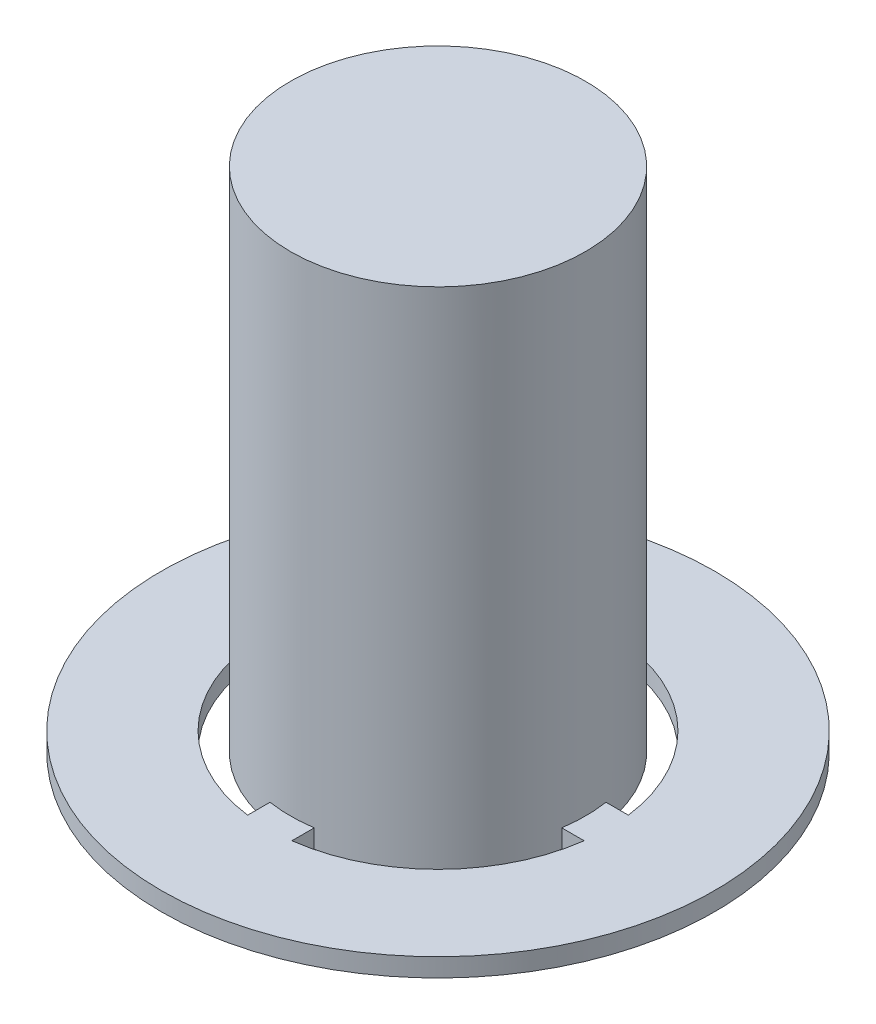
ISO-10303-21;
HEADER;
FILE_DESCRIPTION(('STEP AP214'),'2;1');
FILE_NAME('part.step','',(''),(''),'','','');
FILE_SCHEMA(('AUTOMOTIVE_DESIGN { 1 0 10303 214 1 1 1 1 }'));
ENDSEC;
DATA;
#1=APPLICATION_CONTEXT('core data for automotive mechanical design processes');
#2=APPLICATION_PROTOCOL_DEFINITION('international standard','automotive_design',2000,#1);
#3=PRODUCT_CONTEXT('',#1,'mechanical');
#4=PRODUCT('Part','Part','',(#3));
#5=PRODUCT_RELATED_PRODUCT_CATEGORY('part','',(#4));
#6=PRODUCT_DEFINITION_FORMATION('','',#4);
#7=PRODUCT_DEFINITION_CONTEXT('part definition',#1,'design');
#8=PRODUCT_DEFINITION('design','',#6,#7);
#9=PRODUCT_DEFINITION_SHAPE('','',#8);
#10=(LENGTH_UNIT() NAMED_UNIT(*) SI_UNIT(.MILLI.,.METRE.));
#11=(NAMED_UNIT(*) PLANE_ANGLE_UNIT() SI_UNIT($,.RADIAN.));
#12=(NAMED_UNIT(*) SI_UNIT($,.STERADIAN.) SOLID_ANGLE_UNIT());
#13=UNCERTAINTY_MEASURE_WITH_UNIT(LENGTH_MEASURE(1.E-05),#10,'distance_accuracy_value','');
#14=(GEOMETRIC_REPRESENTATION_CONTEXT(3) GLOBAL_UNCERTAINTY_ASSIGNED_CONTEXT((#13)) GLOBAL_UNIT_ASSIGNED_CONTEXT((#10,
#11,#12)) REPRESENTATION_CONTEXT('',''));
#15=CARTESIAN_POINT('',(0.,0.,0.));
#16=DIRECTION('',(0.,0.,1.));
#17=DIRECTION('',(1.,0.,0.));
#18=AXIS2_PLACEMENT_3D('',#15,#16,#17);
#19=CARTESIAN_POINT('',(-6.,0.5,0.599999999999999));
#20=DIRECTION('',(0.,0.,-1.));
#21=DIRECTION('',(-1.,0.,0.));
#22=AXIS2_PLACEMENT_3D('',#19,#20,#21);
#23=PLANE('',#22);
#24=DIRECTION('',(0.,-1.,0.));
#25=VECTOR('',#24,1.);
#26=CARTESIAN_POINT('',(4.56070170039655,0.5,0.6));
#27=LINE('',#26,#25);
#28=CARTESIAN_POINT('',(4.56070170039655,0.5,0.6));
#29=VERTEX_POINT('',#28);
#30=CARTESIAN_POINT('',(4.56070170039655,0.,0.6));
#31=VERTEX_POINT('',#30);
#32=EDGE_CURVE('E261',#29,#31,#27,.T.);
#33=ORIENTED_EDGE('',*,*,#32,.F.);
#34=DIRECTION('',(1.,0.,0.));
#35=VECTOR('',#34,1.);
#36=CARTESIAN_POINT('',(-6.,0.5,0.599999999999999));
#37=LINE('',#36,#35);
#38=CARTESIAN_POINT('',(3.95474398665704,0.5,0.6));
#39=VERTEX_POINT('',#38);
#40=EDGE_CURVE('E269',#39,#29,#37,.T.);
#41=ORIENTED_EDGE('',*,*,#40,.F.);
#42=DIRECTION('',(0.,-1.,0.));
#43=VECTOR('',#42,1.);
#44=CARTESIAN_POINT('',(3.95474398665704,13.75,0.6));
#45=LINE('',#44,#43);
#46=CARTESIAN_POINT('',(3.95474398665704,0.,0.6));
#47=VERTEX_POINT('',#46);
#48=EDGE_CURVE('E271',#39,#47,#45,.T.);
#49=ORIENTED_EDGE('',*,*,#48,.T.);
#50=DIRECTION('',(1.,0.,0.));
#51=VECTOR('',#50,1.);
#52=CARTESIAN_POINT('',(-6.,0.,0.599999999999999));
#53=LINE('',#52,#51);
#54=EDGE_CURVE('E255',#47,#31,#53,.T.);
#55=ORIENTED_EDGE('',*,*,#54,.T.);
#56=EDGE_LOOP('',(#33,#41,#49,#55));
#57=FACE_BOUND('',#56,.T.);
#58=ADVANCED_FACE('F84',(#57),#23,.F.);
#59=CARTESIAN_POINT('',(-6.,0.5,-0.600000000000001));
#60=DIRECTION('',(0.,0.,-1.));
#61=DIRECTION('',(-1.,0.,0.));
#62=AXIS2_PLACEMENT_3D('',#59,#60,#61);
#63=PLANE('',#62);
#64=DIRECTION('',(1.,0.,0.));
#65=VECTOR('',#64,1.);
#66=CARTESIAN_POINT('',(-6.,0.5,-0.600000000000001));
#67=LINE('',#66,#65);
#68=CARTESIAN_POINT('',(3.95474398665704,0.5,-0.599999999999999));
#69=VERTEX_POINT('',#68);
#70=CARTESIAN_POINT('',(4.56070170039655,0.5,-0.599999999999999));
#71=VERTEX_POINT('',#70);
#72=EDGE_CURVE('E236',#69,#71,#67,.T.);
#73=ORIENTED_EDGE('',*,*,#72,.T.);
#74=DIRECTION('',(0.,-1.,0.));
#75=VECTOR('',#74,1.);
#76=CARTESIAN_POINT('',(4.56070170039655,0.5,-0.599999999999999));
#77=LINE('',#76,#75);
#78=CARTESIAN_POINT('',(4.56070170039655,0.,-0.599999999999999));
#79=VERTEX_POINT('',#78);
#80=EDGE_CURVE('E266',#71,#79,#77,.T.);
#81=ORIENTED_EDGE('',*,*,#80,.T.);
#82=DIRECTION('',(1.,0.,0.));
#83=VECTOR('',#82,1.);
#84=CARTESIAN_POINT('',(-6.,0.,-0.600000000000001));
#85=LINE('',#84,#83);
#86=CARTESIAN_POINT('',(3.95474398665704,0.,-0.599999999999999));
#87=VERTEX_POINT('',#86);
#88=EDGE_CURVE('E209',#87,#79,#85,.T.);
#89=ORIENTED_EDGE('',*,*,#88,.F.);
#90=DIRECTION('',(0.,-1.,0.));
#91=VECTOR('',#90,1.);
#92=CARTESIAN_POINT('',(3.95474398665704,13.75,-0.599999999999999));
#93=LINE('',#92,#91);
#94=EDGE_CURVE('E288',#69,#87,#93,.T.);
#95=ORIENTED_EDGE('',*,*,#94,.F.);
#96=EDGE_LOOP('',(#73,#81,#89,#95));
#97=FACE_BOUND('',#96,.T.);
#98=ADVANCED_FACE('F365',(#97),#63,.T.);
#99=CARTESIAN_POINT('',(-4.56070170039655,0.,-0.600000000000001));
#100=VERTEX_POINT('',#99);
#101=CARTESIAN_POINT('',(-3.95474398665704,0.,-0.600000000000001));
#102=VERTEX_POINT('',#101);
#103=EDGE_CURVE('E88',#100,#102,#85,.T.);
#104=ORIENTED_EDGE('',*,*,#103,.F.);
#105=DIRECTION('',(0.,-1.,0.));
#106=VECTOR('',#105,1.);
#107=CARTESIAN_POINT('',(-4.56070170039655,0.5,-0.600000000000001));
#108=LINE('',#107,#106);
#109=CARTESIAN_POINT('',(-4.56070170039655,0.5,-0.600000000000001));
#110=VERTEX_POINT('',#109);
#111=EDGE_CURVE('E362',#100,#110,#108,.F.);
#112=ORIENTED_EDGE('',*,*,#111,.T.);
#113=CARTESIAN_POINT('',(-3.95474398665704,0.5,-0.600000000000001));
#114=VERTEX_POINT('',#113);
#115=EDGE_CURVE('E240',#110,#114,#67,.T.);
#116=ORIENTED_EDGE('',*,*,#115,.T.);
#117=DIRECTION('',(0.,-1.,0.));
#118=VECTOR('',#117,1.);
#119=CARTESIAN_POINT('',(-3.95474398665704,13.75,-0.600000000000001));
#120=LINE('',#119,#118);
#121=EDGE_CURVE('E295',#102,#114,#120,.F.);
#122=ORIENTED_EDGE('',*,*,#121,.F.);
#123=EDGE_LOOP('',(#104,#112,#116,#122));
#124=FACE_BOUND('',#123,.T.);
#125=ADVANCED_FACE('F381',(#124),#63,.T.);
#126=DIRECTION('',(0.,-1.,0.));
#127=VECTOR('',#126,1.);
#128=CARTESIAN_POINT('',(-4.56070170039655,0.5,0.599999999999999));
#129=LINE('',#128,#127);
#130=CARTESIAN_POINT('',(-4.56070170039655,0.,0.599999999999999));
#131=VERTEX_POINT('',#130);
#132=CARTESIAN_POINT('',(-4.56070170039655,0.5,0.599999999999999));
#133=VERTEX_POINT('',#132);
#134=EDGE_CURVE('E360',#131,#133,#129,.F.);
#135=ORIENTED_EDGE('',*,*,#134,.F.);
#136=CARTESIAN_POINT('',(-3.95474398665704,0.,0.599999999999999));
#137=VERTEX_POINT('',#136);
#138=EDGE_CURVE('E254',#131,#137,#53,.T.);
#139=ORIENTED_EDGE('',*,*,#138,.T.);
#140=DIRECTION('',(0.,-1.,0.));
#141=VECTOR('',#140,1.);
#142=CARTESIAN_POINT('',(-3.95474398665704,13.75,0.599999999999999));
#143=LINE('',#142,#141);
#144=CARTESIAN_POINT('',(-3.95474398665704,0.5,0.599999999999999));
#145=VERTEX_POINT('',#144);
#146=EDGE_CURVE('E274',#137,#145,#143,.F.);
#147=ORIENTED_EDGE('',*,*,#146,.T.);
#148=EDGE_CURVE('E241',#133,#145,#37,.T.);
#149=ORIENTED_EDGE('',*,*,#148,.F.);
#150=EDGE_LOOP('',(#135,#139,#147,#149));
#151=FACE_BOUND('',#150,.T.);
#152=ADVANCED_FACE('F373',(#151),#23,.F.);
#153=CARTESIAN_POINT('',(-0.6,0.5,0.));
#154=DIRECTION('',(1.,0.,0.));
#155=DIRECTION('',(0.,0.,-1.));
#156=AXIS2_PLACEMENT_3D('',#153,#154,#155);
#157=PLANE('',#156);
#158=DIRECTION('',(0.,-1.,0.));
#159=VECTOR('',#158,1.);
#160=CARTESIAN_POINT('',(-0.600000000000001,0.5,4.56070170039655));
#161=LINE('',#160,#159);
#162=CARTESIAN_POINT('',(-0.600000000000001,0.5,4.56070170039655));
#163=VERTEX_POINT('',#162);
#164=CARTESIAN_POINT('',(-0.600000000000001,0.,4.56070170039655));
#165=VERTEX_POINT('',#164);
#166=EDGE_CURVE('E358',#163,#165,#161,.T.);
#167=ORIENTED_EDGE('',*,*,#166,.F.);
#168=DIRECTION('',(0.,0.,1.));
#169=VECTOR('',#168,1.);
#170=CARTESIAN_POINT('',(-0.6,0.5,0.));
#171=LINE('',#170,#169);
#172=CARTESIAN_POINT('',(-0.600000000000001,0.5,3.95474398665704));
#173=VERTEX_POINT('',#172);
#174=EDGE_CURVE('E224',#173,#163,#171,.T.);
#175=ORIENTED_EDGE('',*,*,#174,.F.);
#176=DIRECTION('',(0.,-1.,0.));
#177=VECTOR('',#176,1.);
#178=CARTESIAN_POINT('',(-0.600000000000001,13.75,3.95474398665704));
#179=LINE('',#178,#177);
#180=CARTESIAN_POINT('',(-0.600000000000001,0.,3.95474398665704));
#181=VERTEX_POINT('',#180);
#182=EDGE_CURVE('E273',#173,#181,#179,.T.);
#183=ORIENTED_EDGE('',*,*,#182,.T.);
#184=DIRECTION('',(0.,0.,1.));
#185=VECTOR('',#184,1.);
#186=CARTESIAN_POINT('',(-0.6,0.,0.));
#187=LINE('',#186,#185);
#188=EDGE_CURVE('E252',#181,#165,#187,.T.);
#189=ORIENTED_EDGE('',*,*,#188,.T.);
#190=EDGE_LOOP('',(#167,#175,#183,#189));
#191=FACE_BOUND('',#190,.T.);
#192=ADVANCED_FACE('F335',(#191),#157,.F.);
#193=CARTESIAN_POINT('',(0.6,0.5,0.));
#194=DIRECTION('',(1.,0.,0.));
#195=DIRECTION('',(0.,0.,-1.));
#196=AXIS2_PLACEMENT_3D('',#193,#194,#195);
#197=PLANE('',#196);
#198=DIRECTION('',(0.,0.,1.));
#199=VECTOR('',#198,1.);
#200=CARTESIAN_POINT('',(0.6,0.5,0.));
#201=LINE('',#200,#199);
#202=CARTESIAN_POINT('',(0.599999999999999,0.5,3.95474398665704));
#203=VERTEX_POINT('',#202);
#204=CARTESIAN_POINT('',(0.599999999999999,0.5,4.56070170039655));
#205=VERTEX_POINT('',#204);
#206=EDGE_CURVE('E219',#203,#205,#201,.T.);
#207=ORIENTED_EDGE('',*,*,#206,.T.);
#208=DIRECTION('',(0.,-1.,0.));
#209=VECTOR('',#208,1.);
#210=CARTESIAN_POINT('',(0.599999999999999,0.5,4.56070170039655));
#211=LINE('',#210,#209);
#212=CARTESIAN_POINT('',(0.599999999999999,0.,4.56070170039655));
#213=VERTEX_POINT('',#212);
#214=EDGE_CURVE('E355',#205,#213,#211,.T.);
#215=ORIENTED_EDGE('',*,*,#214,.T.);
#216=DIRECTION('',(0.,0.,1.));
#217=VECTOR('',#216,1.);
#218=CARTESIAN_POINT('',(0.6,0.,0.));
#219=LINE('',#218,#217);
#220=CARTESIAN_POINT('',(0.599999999999999,0.,3.95474398665704));
#221=VERTEX_POINT('',#220);
#222=EDGE_CURVE('E278',#221,#213,#219,.T.);
#223=ORIENTED_EDGE('',*,*,#222,.F.);
#224=DIRECTION('',(0.,-1.,0.));
#225=VECTOR('',#224,1.);
#226=CARTESIAN_POINT('',(0.599999999999999,13.75,3.95474398665704));
#227=LINE('',#226,#225);
#228=EDGE_CURVE('E301',#203,#221,#227,.T.);
#229=ORIENTED_EDGE('',*,*,#228,.F.);
#230=EDGE_LOOP('',(#207,#215,#223,#229));
#231=FACE_BOUND('',#230,.T.);
#232=ADVANCED_FACE('F389',(#231),#197,.T.);
#233=CARTESIAN_POINT('',(-0.6,0.5,0.));
#234=DIRECTION('',(1.,0.,0.));
#235=DIRECTION('',(0.,0.,-1.));
#236=AXIS2_PLACEMENT_3D('',#233,#234,#235);
#237=PLANE('',#236);
#238=DIRECTION('',(0.,-1.,0.));
#239=VECTOR('',#238,1.);
#240=CARTESIAN_POINT('',(-0.599999999999999,0.5,-4.56070170039655));
#241=LINE('',#240,#239);
#242=CARTESIAN_POINT('',(-0.599999999999999,0.,-4.56070170039655));
#243=VERTEX_POINT('',#242);
#244=CARTESIAN_POINT('',(-0.599999999999999,0.5,-4.56070170039655));
#245=VERTEX_POINT('',#244);
#246=EDGE_CURVE('E350',#243,#245,#241,.F.);
#247=ORIENTED_EDGE('',*,*,#246,.F.);
#248=DIRECTION('',(0.,0.,1.));
#249=VECTOR('',#248,1.);
#250=CARTESIAN_POINT('',(-0.6,0.,0.));
#251=LINE('',#250,#249);
#252=CARTESIAN_POINT('',(-0.599999999999999,0.,-3.95474398665704));
#253=VERTEX_POINT('',#252);
#254=EDGE_CURVE('E218',#243,#253,#251,.T.);
#255=ORIENTED_EDGE('',*,*,#254,.T.);
#256=DIRECTION('',(0.,-1.,0.));
#257=VECTOR('',#256,1.);
#258=CARTESIAN_POINT('',(-0.599999999999999,13.75,-3.95474398665704));
#259=LINE('',#258,#257);
#260=CARTESIAN_POINT('',(-0.599999999999999,0.5,-3.95474398665704));
#261=VERTEX_POINT('',#260);
#262=EDGE_CURVE('E300',#253,#261,#259,.F.);
#263=ORIENTED_EDGE('',*,*,#262,.T.);
#264=DIRECTION('',(0.,0.,1.));
#265=VECTOR('',#264,1.);
#266=CARTESIAN_POINT('',(-0.6,0.5,0.));
#267=LINE('',#266,#265);
#268=EDGE_CURVE('E287',#245,#261,#267,.T.);
#269=ORIENTED_EDGE('',*,*,#268,.F.);
#270=EDGE_LOOP('',(#247,#255,#263,#269));
#271=FACE_BOUND('',#270,.T.);
#272=ADVANCED_FACE('F387',(#271),#237,.F.);
#273=CARTESIAN_POINT('',(0.6,0.5,0.));
#274=DIRECTION('',(1.,0.,0.));
#275=DIRECTION('',(0.,0.,-1.));
#276=AXIS2_PLACEMENT_3D('',#273,#274,#275);
#277=PLANE('',#276);
#278=DIRECTION('',(0.,0.,1.));
#279=VECTOR('',#278,1.);
#280=CARTESIAN_POINT('',(0.6,0.,0.));
#281=LINE('',#280,#279);
#282=CARTESIAN_POINT('',(0.600000000000001,0.,-4.56070170039655));
#283=VERTEX_POINT('',#282);
#284=CARTESIAN_POINT('',(0.600000000000001,0.,-3.95474398665704));
#285=VERTEX_POINT('',#284);
#286=EDGE_CURVE('E207',#283,#285,#281,.T.);
#287=ORIENTED_EDGE('',*,*,#286,.F.);
#288=DIRECTION('',(0.,-1.,0.));
#289=VECTOR('',#288,1.);
#290=CARTESIAN_POINT('',(0.600000000000001,0.5,-4.56070170039655));
#291=LINE('',#290,#289);
#292=CARTESIAN_POINT('',(0.600000000000001,0.5,-4.56070170039655));
#293=VERTEX_POINT('',#292);
#294=EDGE_CURVE('E12',#283,#293,#291,.F.);
#295=ORIENTED_EDGE('',*,*,#294,.T.);
#296=DIRECTION('',(0.,0.,1.));
#297=VECTOR('',#296,1.);
#298=CARTESIAN_POINT('',(0.6,0.5,0.));
#299=LINE('',#298,#297);
#300=CARTESIAN_POINT('',(0.600000000000001,0.5,-3.95474398665704));
#301=VERTEX_POINT('',#300);
#302=EDGE_CURVE('E221',#293,#301,#299,.T.);
#303=ORIENTED_EDGE('',*,*,#302,.T.);
#304=DIRECTION('',(0.,-1.,0.));
#305=VECTOR('',#304,1.);
#306=CARTESIAN_POINT('',(0.600000000000001,13.75,-3.95474398665704));
#307=LINE('',#306,#305);
#308=EDGE_CURVE('E217',#285,#301,#307,.F.);
#309=ORIENTED_EDGE('',*,*,#308,.F.);
#310=EDGE_LOOP('',(#287,#295,#303,#309));
#311=FACE_BOUND('',#310,.T.);
#312=ADVANCED_FACE('F215',(#311),#277,.T.);
#313=CARTESIAN_POINT('',(0.,13.75,0.));
#314=DIRECTION('',(0.,-1.,0.));
#315=DIRECTION('',(0.,0.,-1.));
#316=AXIS2_PLACEMENT_3D('',#313,#314,#315);
#317=CYLINDRICAL_SURFACE('',#316,4.);
#318=CARTESIAN_POINT('',(0.,13.75,0.));
#319=DIRECTION('',(0.,1.,0.));
#320=DIRECTION('',(0.,0.,1.));
#321=AXIS2_PLACEMENT_3D('',#318,#319,#320);
#322=CIRCLE('',#321,4.);
#323=CARTESIAN_POINT('',(0.,13.75,4.));
#324=VERTEX_POINT('',#323);
#325=EDGE_CURVE('E309',#324,#324,#322,.T.);
#326=ORIENTED_EDGE('',*,*,#325,.F.);
#327=EDGE_LOOP('',(#326));
#328=FACE_BOUND('',#327,.T.);
#329=ORIENTED_EDGE('',*,*,#262,.F.);
#330=CARTESIAN_POINT('',(0.,0.,0.));
#331=DIRECTION('',(0.,1.,0.));
#332=DIRECTION('',(0.,0.,1.));
#333=AXIS2_PLACEMENT_3D('',#330,#331,#332);
#334=CIRCLE('',#333,4.);
#335=EDGE_CURVE('E379',#253,#102,#334,.T.);
#336=ORIENTED_EDGE('',*,*,#335,.T.);
#337=ORIENTED_EDGE('',*,*,#121,.T.);
#338=CARTESIAN_POINT('',(0.,0.5,0.));
#339=DIRECTION('',(0.,-1.,0.));
#340=DIRECTION('',(0.,0.,-1.));
#341=AXIS2_PLACEMENT_3D('',#338,#339,#340);
#342=CIRCLE('',#341,4.);
#343=EDGE_CURVE('E308',#145,#114,#342,.T.);
#344=ORIENTED_EDGE('',*,*,#343,.F.);
#345=ORIENTED_EDGE('',*,*,#146,.F.);
#346=EDGE_CURVE('E320',#137,#181,#334,.T.);
#347=ORIENTED_EDGE('',*,*,#346,.T.);
#348=ORIENTED_EDGE('',*,*,#182,.F.);
#349=EDGE_CURVE('E306',#203,#173,#342,.T.);
#350=ORIENTED_EDGE('',*,*,#349,.F.);
#351=ORIENTED_EDGE('',*,*,#228,.T.);
#352=EDGE_CURVE('E315',#221,#47,#334,.T.);
#353=ORIENTED_EDGE('',*,*,#352,.T.);
#354=ORIENTED_EDGE('',*,*,#48,.F.);
#355=EDGE_CURVE('E229',#69,#39,#342,.T.);
#356=ORIENTED_EDGE('',*,*,#355,.F.);
#357=ORIENTED_EDGE('',*,*,#94,.T.);
#358=EDGE_CURVE('E299',#87,#285,#334,.T.);
#359=ORIENTED_EDGE('',*,*,#358,.T.);
#360=ORIENTED_EDGE('',*,*,#308,.T.);
#361=EDGE_CURVE('E94',#261,#301,#342,.T.);
#362=ORIENTED_EDGE('',*,*,#361,.F.);
#363=EDGE_LOOP('',(#329,#336,#337,#344,#345,#347,#348,#350,#351,#353,#354,#356,#357,#359,#360,#362));
#364=FACE_BOUND('',#363,.T.);
#365=ADVANCED_FACE('F86',(#328,#364),#317,.T.);
#366=CARTESIAN_POINT('',(0.,13.75,0.));
#367=DIRECTION('',(0.,1.,0.));
#368=DIRECTION('',(0.,0.,1.));
#369=AXIS2_PLACEMENT_3D('',#366,#367,#368);
#370=PLANE('',#369);
#371=ORIENTED_EDGE('',*,*,#325,.T.);
#372=EDGE_LOOP('',(#371));
#373=FACE_BOUND('',#372,.T.);
#374=ADVANCED_FACE('F428',(#373),#370,.T.);
#375=CARTESIAN_POINT('',(0.,0.,0.));
#376=DIRECTION('',(0.,1.,0.));
#377=DIRECTION('',(0.,0.,1.));
#378=AXIS2_PLACEMENT_3D('',#375,#376,#377);
#379=PLANE('',#378);
#380=ORIENTED_EDGE('',*,*,#88,.T.);
#381=CARTESIAN_POINT('',(0.,0.,0.));
#382=DIRECTION('',(0.,-1.,0.));
#383=DIRECTION('',(0.,0.,-1.));
#384=AXIS2_PLACEMENT_3D('',#381,#382,#383);
#385=CIRCLE('',#384,4.6);
#386=EDGE_CURVE('E102',#283,#79,#385,.T.);
#387=ORIENTED_EDGE('',*,*,#386,.F.);
#388=ORIENTED_EDGE('',*,*,#286,.T.);
#389=ORIENTED_EDGE('',*,*,#358,.F.);
#390=EDGE_LOOP('',(#380,#387,#388,#389));
#391=FACE_BOUND('',#390,.T.);
#392=ORIENTED_EDGE('',*,*,#254,.F.);
#393=EDGE_CURVE('E213',#100,#243,#385,.T.);
#394=ORIENTED_EDGE('',*,*,#393,.F.);
#395=ORIENTED_EDGE('',*,*,#103,.T.);
#396=ORIENTED_EDGE('',*,*,#335,.F.);
#397=EDGE_LOOP('',(#392,#394,#395,#396));
#398=FACE_BOUND('',#397,.T.);
#399=ORIENTED_EDGE('',*,*,#138,.F.);
#400=EDGE_CURVE('E342',#165,#131,#385,.T.);
#401=ORIENTED_EDGE('',*,*,#400,.F.);
#402=ORIENTED_EDGE('',*,*,#188,.F.);
#403=ORIENTED_EDGE('',*,*,#346,.F.);
#404=EDGE_LOOP('',(#399,#401,#402,#403));
#405=FACE_BOUND('',#404,.T.);
#406=EDGE_CURVE('E211',#31,#213,#385,.T.);
#407=ORIENTED_EDGE('',*,*,#406,.F.);
#408=ORIENTED_EDGE('',*,*,#54,.F.);
#409=ORIENTED_EDGE('',*,*,#352,.F.);
#410=ORIENTED_EDGE('',*,*,#222,.T.);
#411=EDGE_LOOP('',(#407,#408,#409,#410));
#412=FACE_BOUND('',#411,.T.);
#413=CARTESIAN_POINT('',(0.,0.,0.));
#414=DIRECTION('',(0.,-1.,0.));
#415=DIRECTION('',(0.,0.,-1.));
#416=AXIS2_PLACEMENT_3D('',#413,#414,#415);
#417=CIRCLE('',#416,7.5);
#418=CARTESIAN_POINT('',(0.,0.,-7.5));
#419=VERTEX_POINT('',#418);
#420=EDGE_CURVE('E351',#419,#419,#417,.T.);
#421=ORIENTED_EDGE('',*,*,#420,.T.);
#422=EDGE_LOOP('',(#421));
#423=FACE_BOUND('',#422,.T.);
#424=ADVANCED_FACE('F204',(#391,#398,#405,#412,#423),#379,.F.);
#425=CARTESIAN_POINT('',(0.,0.5,0.));
#426=DIRECTION('',(0.,-1.,0.));
#427=DIRECTION('',(0.,0.,-1.));
#428=AXIS2_PLACEMENT_3D('',#425,#426,#427);
#429=PLANE('',#428);
#430=ORIENTED_EDGE('',*,*,#40,.T.);
#431=CARTESIAN_POINT('',(0.,0.5,0.));
#432=DIRECTION('',(0.,-1.,0.));
#433=DIRECTION('',(0.,0.,-1.));
#434=AXIS2_PLACEMENT_3D('',#431,#432,#433);
#435=CIRCLE('',#434,4.6);
#436=EDGE_CURVE('E366',#29,#205,#435,.T.);
#437=ORIENTED_EDGE('',*,*,#436,.T.);
#438=ORIENTED_EDGE('',*,*,#206,.F.);
#439=ORIENTED_EDGE('',*,*,#349,.T.);
#440=ORIENTED_EDGE('',*,*,#174,.T.);
#441=EDGE_CURVE('E368',#163,#133,#435,.T.);
#442=ORIENTED_EDGE('',*,*,#441,.T.);
#443=ORIENTED_EDGE('',*,*,#148,.T.);
#444=ORIENTED_EDGE('',*,*,#343,.T.);
#445=ORIENTED_EDGE('',*,*,#115,.F.);
#446=EDGE_CURVE('E210',#110,#245,#435,.T.);
#447=ORIENTED_EDGE('',*,*,#446,.T.);
#448=ORIENTED_EDGE('',*,*,#268,.T.);
#449=ORIENTED_EDGE('',*,*,#361,.T.);
#450=ORIENTED_EDGE('',*,*,#302,.F.);
#451=EDGE_CURVE('E198',#293,#71,#435,.T.);
#452=ORIENTED_EDGE('',*,*,#451,.T.);
#453=ORIENTED_EDGE('',*,*,#72,.F.);
#454=ORIENTED_EDGE('',*,*,#355,.T.);
#455=EDGE_LOOP('',(#430,#437,#438,#439,#440,#442,#443,#444,#445,#447,#448,#449,#450,#452,#453,#454));
#456=FACE_BOUND('',#455,.T.);
#457=CARTESIAN_POINT('',(0.,0.5,0.));
#458=DIRECTION('',(0.,-1.,0.));
#459=DIRECTION('',(0.,0.,-1.));
#460=AXIS2_PLACEMENT_3D('',#457,#458,#459);
#461=CIRCLE('',#460,7.5);
#462=CARTESIAN_POINT('',(0.,0.5,-7.5));
#463=VERTEX_POINT('',#462);
#464=EDGE_CURVE('E347',#463,#463,#461,.T.);
#465=ORIENTED_EDGE('',*,*,#464,.F.);
#466=EDGE_LOOP('',(#465));
#467=FACE_BOUND('',#466,.T.);
#468=ADVANCED_FACE('F304',(#456,#467),#429,.F.);
#469=CARTESIAN_POINT('',(0.,0.5,0.));
#470=DIRECTION('',(0.,-1.,0.));
#471=DIRECTION('',(0.,0.,-1.));
#472=AXIS2_PLACEMENT_3D('',#469,#470,#471);
#473=CYLINDRICAL_SURFACE('',#472,4.6);
#474=ORIENTED_EDGE('',*,*,#436,.F.);
#475=ORIENTED_EDGE('',*,*,#32,.T.);
#476=ORIENTED_EDGE('',*,*,#406,.T.);
#477=ORIENTED_EDGE('',*,*,#214,.F.);
#478=EDGE_LOOP('',(#474,#475,#476,#477));
#479=FACE_BOUND('',#478,.T.);
#480=ADVANCED_FACE('F448',(#479),#473,.F.);
#481=ORIENTED_EDGE('',*,*,#400,.T.);
#482=ORIENTED_EDGE('',*,*,#134,.T.);
#483=ORIENTED_EDGE('',*,*,#441,.F.);
#484=ORIENTED_EDGE('',*,*,#166,.T.);
#485=EDGE_LOOP('',(#481,#482,#483,#484));
#486=FACE_BOUND('',#485,.T.);
#487=ADVANCED_FACE('F372',(#486),#473,.F.);
#488=ORIENTED_EDGE('',*,*,#111,.F.);
#489=ORIENTED_EDGE('',*,*,#393,.T.);
#490=ORIENTED_EDGE('',*,*,#246,.T.);
#491=ORIENTED_EDGE('',*,*,#446,.F.);
#492=EDGE_LOOP('',(#488,#489,#490,#491));
#493=FACE_BOUND('',#492,.T.);
#494=ADVANCED_FACE('F384',(#493),#473,.F.);
#495=ORIENTED_EDGE('',*,*,#80,.F.);
#496=ORIENTED_EDGE('',*,*,#451,.F.);
#497=ORIENTED_EDGE('',*,*,#294,.F.);
#498=ORIENTED_EDGE('',*,*,#386,.T.);
#499=EDGE_LOOP('',(#495,#496,#497,#498));
#500=FACE_BOUND('',#499,.T.);
#501=ADVANCED_FACE('F196',(#500),#473,.F.);
#502=CARTESIAN_POINT('',(0.,0.5,0.));
#503=DIRECTION('',(0.,-1.,0.));
#504=DIRECTION('',(0.,0.,-1.));
#505=AXIS2_PLACEMENT_3D('',#502,#503,#504);
#506=CYLINDRICAL_SURFACE('',#505,7.5);
#507=ORIENTED_EDGE('',*,*,#464,.T.);
#508=EDGE_LOOP('',(#507));
#509=FACE_BOUND('',#508,.T.);
#510=ORIENTED_EDGE('',*,*,#420,.F.);
#511=EDGE_LOOP('',(#510));
#512=FACE_BOUND('',#511,.T.);
#513=ADVANCED_FACE('F471',(#509,#512),#506,.T.);
#514=CLOSED_SHELL('',(#58,#98,#125,#152,#192,#232,#272,#312,#365,#374,#424,#468,#480,#487,#494,
#501,#513));
#515=MANIFOLD_SOLID_BREP('B2',#514);
#516=ADVANCED_BREP_SHAPE_REPRESENTATION('',(#18,#515),#14);
#517=SHAPE_DEFINITION_REPRESENTATION(#9,#516);
ENDSEC;
END-ISO-10303-21;
